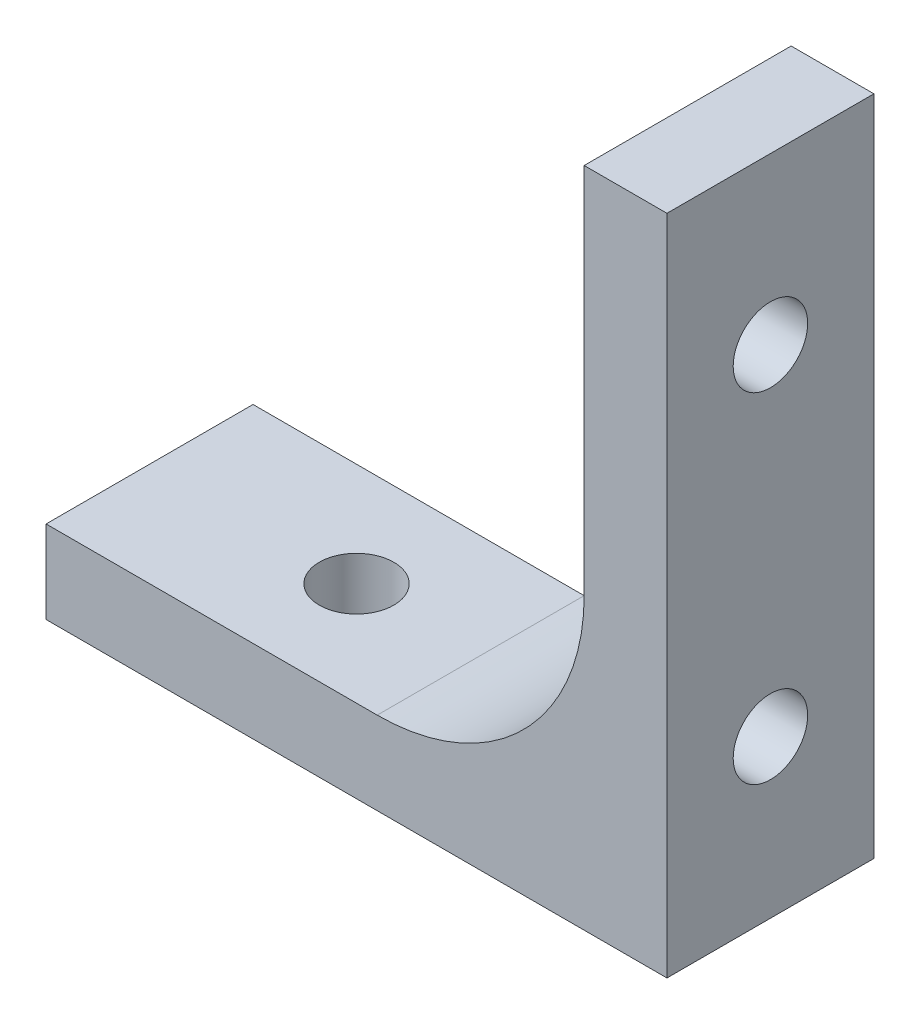
ISO-10303-21;
HEADER;
FILE_DESCRIPTION(('STEP AP214'),'2;1');
FILE_NAME('part.step','',(''),(''),'','','');
FILE_SCHEMA(('AUTOMOTIVE_DESIGN { 1 0 10303 214 1 1 1 1 }'));
ENDSEC;
DATA;
#1=APPLICATION_CONTEXT('core data for automotive mechanical design processes');
#2=APPLICATION_PROTOCOL_DEFINITION('international standard','automotive_design',2000,#1);
#3=PRODUCT_CONTEXT('',#1,'mechanical');
#4=PRODUCT('Part','Part','',(#3));
#5=PRODUCT_RELATED_PRODUCT_CATEGORY('part','',(#4));
#6=PRODUCT_DEFINITION_FORMATION('','',#4);
#7=PRODUCT_DEFINITION_CONTEXT('part definition',#1,'design');
#8=PRODUCT_DEFINITION('design','',#6,#7);
#9=PRODUCT_DEFINITION_SHAPE('','',#8);
#10=(LENGTH_UNIT() NAMED_UNIT(*) SI_UNIT(.MILLI.,.METRE.));
#11=(NAMED_UNIT(*) PLANE_ANGLE_UNIT() SI_UNIT($,.RADIAN.));
#12=(NAMED_UNIT(*) SI_UNIT($,.STERADIAN.) SOLID_ANGLE_UNIT());
#13=UNCERTAINTY_MEASURE_WITH_UNIT(LENGTH_MEASURE(1.E-05),#10,'distance_accuracy_value','');
#14=(GEOMETRIC_REPRESENTATION_CONTEXT(3) GLOBAL_UNCERTAINTY_ASSIGNED_CONTEXT((#13)) GLOBAL_UNIT_ASSIGNED_CONTEXT((#10,
#11,#12)) REPRESENTATION_CONTEXT('',''));
#15=CARTESIAN_POINT('',(0.,0.,0.));
#16=DIRECTION('',(0.,0.,1.));
#17=DIRECTION('',(1.,0.,0.));
#18=AXIS2_PLACEMENT_3D('',#15,#16,#17);
#19=CARTESIAN_POINT('',(0.,2.54,0.));
#20=DIRECTION('',(0.,-1.,0.));
#21=DIRECTION('',(0.,0.,-1.));
#22=AXIS2_PLACEMENT_3D('',#19,#20,#21);
#23=PLANE('',#22);
#24=CARTESIAN_POINT('',(6.35,2.54,-3.175));
#25=DIRECTION('',(0.,1.,0.));
#26=DIRECTION('',(0.,0.,1.));
#27=AXIS2_PLACEMENT_3D('',#24,#25,#26);
#28=CIRCLE('',#27,1.143);
#29=CARTESIAN_POINT('',(6.35,2.54,-2.032));
#30=VERTEX_POINT('',#29);
#31=EDGE_CURVE('E125',#30,#30,#28,.T.);
#32=ORIENTED_EDGE('',*,*,#31,.F.);
#33=EDGE_LOOP('',(#32));
#34=FACE_BOUND('',#33,.T.);
#35=DIRECTION('',(1.,0.,0.));
#36=VECTOR('',#35,1.);
#37=CARTESIAN_POINT('',(0.,2.54,0.));
#38=LINE('',#37,#36);
#39=CARTESIAN_POINT('',(0.,2.54,0.));
#40=VERTEX_POINT('',#39);
#41=CARTESIAN_POINT('',(10.16,2.54,0.));
#42=VERTEX_POINT('',#41);
#43=EDGE_CURVE('E135',#40,#42,#38,.T.);
#44=ORIENTED_EDGE('',*,*,#43,.T.);
#45=DIRECTION('',(0.,0.,1.));
#46=VECTOR('',#45,1.);
#47=CARTESIAN_POINT('',(10.16,2.54,-6.35));
#48=LINE('',#47,#46);
#49=CARTESIAN_POINT('',(10.16,2.54,-6.35));
#50=VERTEX_POINT('',#49);
#51=EDGE_CURVE('E60',#42,#50,#48,.F.);
#52=ORIENTED_EDGE('',*,*,#51,.T.);
#53=DIRECTION('',(-1.,0.,0.));
#54=VECTOR('',#53,1.);
#55=CARTESIAN_POINT('',(0.,2.54,-6.35));
#56=LINE('',#55,#54);
#57=CARTESIAN_POINT('',(0.,2.54,-6.35));
#58=VERTEX_POINT('',#57);
#59=EDGE_CURVE('E144',#50,#58,#56,.T.);
#60=ORIENTED_EDGE('',*,*,#59,.T.);
#61=DIRECTION('',(0.,0.,1.));
#62=VECTOR('',#61,1.);
#63=CARTESIAN_POINT('',(0.,2.54,0.));
#64=LINE('',#63,#62);
#65=EDGE_CURVE('E132',#58,#40,#64,.T.);
#66=ORIENTED_EDGE('',*,*,#65,.T.);
#67=EDGE_LOOP('',(#44,#52,#60,#66));
#68=FACE_BOUND('',#67,.T.);
#69=ADVANCED_FACE('F33',(#34,#68),#23,.F.);
#70=CARTESIAN_POINT('',(0.,2.54,0.));
#71=DIRECTION('',(1.,0.,0.));
#72=DIRECTION('',(0.,0.,-1.));
#73=AXIS2_PLACEMENT_3D('',#70,#71,#72);
#74=PLANE('',#73);
#75=DIRECTION('',(0.,0.,1.));
#76=VECTOR('',#75,1.);
#77=CARTESIAN_POINT('',(0.,0.,0.));
#78=LINE('',#77,#76);
#79=CARTESIAN_POINT('',(0.,0.,-6.35));
#80=VERTEX_POINT('',#79);
#81=CARTESIAN_POINT('',(0.,0.,0.));
#82=VERTEX_POINT('',#81);
#83=EDGE_CURVE('E151',#80,#82,#78,.T.);
#84=ORIENTED_EDGE('',*,*,#83,.T.);
#85=DIRECTION('',(0.,-1.,0.));
#86=VECTOR('',#85,1.);
#87=CARTESIAN_POINT('',(0.,2.54,0.));
#88=LINE('',#87,#86);
#89=EDGE_CURVE('E145',#40,#82,#88,.T.);
#90=ORIENTED_EDGE('',*,*,#89,.F.);
#91=ORIENTED_EDGE('',*,*,#65,.F.);
#92=DIRECTION('',(0.,-1.,0.));
#93=VECTOR('',#92,1.);
#94=CARTESIAN_POINT('',(0.,2.54,-6.35));
#95=LINE('',#94,#93);
#96=EDGE_CURVE('E107',#58,#80,#95,.T.);
#97=ORIENTED_EDGE('',*,*,#96,.T.);
#98=EDGE_LOOP('',(#84,#90,#91,#97));
#99=FACE_BOUND('',#98,.T.);
#100=ADVANCED_FACE('F203',(#99),#74,.F.);
#101=CARTESIAN_POINT('',(0.,2.54,0.));
#102=DIRECTION('',(0.,0.,-1.));
#103=DIRECTION('',(-1.,0.,0.));
#104=AXIS2_PLACEMENT_3D('',#101,#102,#103);
#105=PLANE('',#104);
#106=DIRECTION('',(1.,0.,0.));
#107=VECTOR('',#106,1.);
#108=CARTESIAN_POINT('',(0.,0.,0.));
#109=LINE('',#108,#107);
#110=CARTESIAN_POINT('',(19.05,0.,0.));
#111=VERTEX_POINT('',#110);
#112=EDGE_CURVE('E193',#82,#111,#109,.T.);
#113=ORIENTED_EDGE('',*,*,#112,.T.);
#114=DIRECTION('',(0.,-1.,0.));
#115=VECTOR('',#114,1.);
#116=CARTESIAN_POINT('',(19.05,2.54,0.));
#117=LINE('',#116,#115);
#118=CARTESIAN_POINT('',(19.05,20.32,0.));
#119=VERTEX_POINT('',#118);
#120=EDGE_CURVE('E106',#119,#111,#117,.T.);
#121=ORIENTED_EDGE('',*,*,#120,.F.);
#122=DIRECTION('',(1.,0.,0.));
#123=VECTOR('',#122,1.);
#124=CARTESIAN_POINT('',(19.05,20.32,0.));
#125=LINE('',#124,#123);
#126=CARTESIAN_POINT('',(16.51,20.32,0.));
#127=VERTEX_POINT('',#126);
#128=EDGE_CURVE('E121',#127,#119,#125,.T.);
#129=ORIENTED_EDGE('',*,*,#128,.F.);
#130=DIRECTION('',(0.,-1.,0.));
#131=VECTOR('',#130,1.);
#132=CARTESIAN_POINT('',(16.51,20.32,0.));
#133=LINE('',#132,#131);
#134=CARTESIAN_POINT('',(16.51,8.89,0.));
#135=VERTEX_POINT('',#134);
#136=EDGE_CURVE('E131',#127,#135,#133,.T.);
#137=ORIENTED_EDGE('',*,*,#136,.T.);
#138=CARTESIAN_POINT('',(10.16,8.89,0.));
#139=DIRECTION('',(0.,0.,-1.));
#140=DIRECTION('',(-1.,0.,0.));
#141=AXIS2_PLACEMENT_3D('',#138,#139,#140);
#142=CIRCLE('',#141,6.35);
#143=EDGE_CURVE('E46',#135,#42,#142,.T.);
#144=ORIENTED_EDGE('',*,*,#143,.T.);
#145=ORIENTED_EDGE('',*,*,#43,.F.);
#146=ORIENTED_EDGE('',*,*,#89,.T.);
#147=EDGE_LOOP('',(#113,#121,#129,#137,#144,#145,#146));
#148=FACE_BOUND('',#147,.T.);
#149=ADVANCED_FACE('F191',(#148),#105,.F.);
#150=CARTESIAN_POINT('',(19.05,2.54,0.));
#151=DIRECTION('',(-1.,0.,0.));
#152=DIRECTION('',(0.,0.,1.));
#153=AXIS2_PLACEMENT_3D('',#150,#151,#152);
#154=PLANE('',#153);
#155=CARTESIAN_POINT('',(19.05,4.826,-3.175));
#156=DIRECTION('',(-1.,0.,0.));
#157=DIRECTION('',(0.,0.,1.));
#158=AXIS2_PLACEMENT_3D('',#155,#156,#157);
#159=CIRCLE('',#158,1.143);
#160=CARTESIAN_POINT('',(19.05,4.826,-2.032));
#161=VERTEX_POINT('',#160);
#162=EDGE_CURVE('E170',#161,#161,#159,.T.);
#163=ORIENTED_EDGE('',*,*,#162,.T.);
#164=EDGE_LOOP('',(#163));
#165=FACE_BOUND('',#164,.T.);
#166=CARTESIAN_POINT('',(19.05,15.24,-3.175));
#167=DIRECTION('',(-1.,0.,0.));
#168=DIRECTION('',(0.,0.,1.));
#169=AXIS2_PLACEMENT_3D('',#166,#167,#168);
#170=CIRCLE('',#169,1.143);
#171=CARTESIAN_POINT('',(19.05,15.24,-2.032));
#172=VERTEX_POINT('',#171);
#173=EDGE_CURVE('E161',#172,#172,#170,.T.);
#174=ORIENTED_EDGE('',*,*,#173,.T.);
#175=EDGE_LOOP('',(#174));
#176=FACE_BOUND('',#175,.T.);
#177=DIRECTION('',(0.,0.,-1.));
#178=VECTOR('',#177,1.);
#179=CARTESIAN_POINT('',(19.05,0.,0.));
#180=LINE('',#179,#178);
#181=CARTESIAN_POINT('',(19.05,0.,-6.35));
#182=VERTEX_POINT('',#181);
#183=EDGE_CURVE('E103',#111,#182,#180,.T.);
#184=ORIENTED_EDGE('',*,*,#183,.T.);
#185=DIRECTION('',(0.,-1.,0.));
#186=VECTOR('',#185,1.);
#187=CARTESIAN_POINT('',(19.05,2.54,-6.35));
#188=LINE('',#187,#186);
#189=CARTESIAN_POINT('',(19.05,20.32,-6.35));
#190=VERTEX_POINT('',#189);
#191=EDGE_CURVE('E96',#190,#182,#188,.T.);
#192=ORIENTED_EDGE('',*,*,#191,.F.);
#193=DIRECTION('',(0.,0.,-1.));
#194=VECTOR('',#193,1.);
#195=CARTESIAN_POINT('',(19.05,20.32,-6.35));
#196=LINE('',#195,#194);
#197=EDGE_CURVE('E101',#119,#190,#196,.T.);
#198=ORIENTED_EDGE('',*,*,#197,.F.);
#199=ORIENTED_EDGE('',*,*,#120,.T.);
#200=EDGE_LOOP('',(#184,#192,#198,#199));
#201=FACE_BOUND('',#200,.T.);
#202=ADVANCED_FACE('F98',(#165,#176,#201),#154,.F.);
#203=CARTESIAN_POINT('',(0.,2.54,-6.35));
#204=DIRECTION('',(0.,0.,1.));
#205=DIRECTION('',(1.,0.,0.));
#206=AXIS2_PLACEMENT_3D('',#203,#204,#205);
#207=PLANE('',#206);
#208=DIRECTION('',(-1.,0.,0.));
#209=VECTOR('',#208,1.);
#210=CARTESIAN_POINT('',(0.,0.,-6.35));
#211=LINE('',#210,#209);
#212=EDGE_CURVE('E136',#182,#80,#211,.T.);
#213=ORIENTED_EDGE('',*,*,#212,.T.);
#214=ORIENTED_EDGE('',*,*,#96,.F.);
#215=ORIENTED_EDGE('',*,*,#59,.F.);
#216=CARTESIAN_POINT('',(10.16,8.89,-6.35));
#217=DIRECTION('',(0.,0.,1.));
#218=DIRECTION('',(1.,0.,0.));
#219=AXIS2_PLACEMENT_3D('',#216,#217,#218);
#220=CIRCLE('',#219,6.35);
#221=CARTESIAN_POINT('',(16.51,8.89,-6.35));
#222=VERTEX_POINT('',#221);
#223=EDGE_CURVE('E11',#50,#222,#220,.T.);
#224=ORIENTED_EDGE('',*,*,#223,.T.);
#225=DIRECTION('',(0.,-1.,0.));
#226=VECTOR('',#225,1.);
#227=CARTESIAN_POINT('',(16.51,20.32,-6.35));
#228=LINE('',#227,#226);
#229=CARTESIAN_POINT('',(16.51,20.32,-6.35));
#230=VERTEX_POINT('',#229);
#231=EDGE_CURVE('E113',#230,#222,#228,.T.);
#232=ORIENTED_EDGE('',*,*,#231,.F.);
#233=DIRECTION('',(-1.,0.,0.));
#234=VECTOR('',#233,1.);
#235=CARTESIAN_POINT('',(19.05,20.32,-6.35));
#236=LINE('',#235,#234);
#237=EDGE_CURVE('E110',#190,#230,#236,.T.);
#238=ORIENTED_EDGE('',*,*,#237,.F.);
#239=ORIENTED_EDGE('',*,*,#191,.T.);
#240=EDGE_LOOP('',(#213,#214,#215,#224,#232,#238,#239));
#241=FACE_BOUND('',#240,.T.);
#242=ADVANCED_FACE('F111',(#241),#207,.F.);
#243=CARTESIAN_POINT('',(0.,0.,0.));
#244=DIRECTION('',(0.,-1.,0.));
#245=DIRECTION('',(0.,0.,-1.));
#246=AXIS2_PLACEMENT_3D('',#243,#244,#245);
#247=PLANE('',#246);
#248=CARTESIAN_POINT('',(6.35,0.,-3.175));
#249=DIRECTION('',(0.,1.,0.));
#250=DIRECTION('',(0.,0.,1.));
#251=AXIS2_PLACEMENT_3D('',#248,#249,#250);
#252=CIRCLE('',#251,1.143);
#253=CARTESIAN_POINT('',(6.35,0.,-2.032));
#254=VERTEX_POINT('',#253);
#255=EDGE_CURVE('E122',#254,#254,#252,.T.);
#256=ORIENTED_EDGE('',*,*,#255,.T.);
#257=EDGE_LOOP('',(#256));
#258=FACE_BOUND('',#257,.T.);
#259=ORIENTED_EDGE('',*,*,#83,.F.);
#260=ORIENTED_EDGE('',*,*,#212,.F.);
#261=ORIENTED_EDGE('',*,*,#183,.F.);
#262=ORIENTED_EDGE('',*,*,#112,.F.);
#263=EDGE_LOOP('',(#259,#260,#261,#262));
#264=FACE_BOUND('',#263,.T.);
#265=ADVANCED_FACE('F206',(#258,#264),#247,.T.);
#266=CARTESIAN_POINT('',(16.51,20.32,-6.35));
#267=DIRECTION('',(1.,0.,0.));
#268=DIRECTION('',(0.,0.,-1.));
#269=AXIS2_PLACEMENT_3D('',#266,#267,#268);
#270=PLANE('',#269);
#271=CARTESIAN_POINT('',(16.51,15.24,-3.175));
#272=DIRECTION('',(1.,0.,0.));
#273=DIRECTION('',(0.,0.,-1.));
#274=AXIS2_PLACEMENT_3D('',#271,#272,#273);
#275=CIRCLE('',#274,1.143);
#276=CARTESIAN_POINT('',(16.51,15.24,-4.318));
#277=VERTEX_POINT('',#276);
#278=EDGE_CURVE('E159',#277,#277,#275,.T.);
#279=ORIENTED_EDGE('',*,*,#278,.T.);
#280=EDGE_LOOP('',(#279));
#281=FACE_BOUND('',#280,.T.);
#282=ORIENTED_EDGE('',*,*,#231,.T.);
#283=DIRECTION('',(0.,0.,1.));
#284=VECTOR('',#283,1.);
#285=CARTESIAN_POINT('',(16.51,8.89,0.));
#286=LINE('',#285,#284);
#287=EDGE_CURVE('E154',#222,#135,#286,.T.);
#288=ORIENTED_EDGE('',*,*,#287,.T.);
#289=ORIENTED_EDGE('',*,*,#136,.F.);
#290=DIRECTION('',(0.,0.,1.));
#291=VECTOR('',#290,1.);
#292=CARTESIAN_POINT('',(16.51,20.32,-6.35));
#293=LINE('',#292,#291);
#294=EDGE_CURVE('E116',#230,#127,#293,.T.);
#295=ORIENTED_EDGE('',*,*,#294,.F.);
#296=EDGE_LOOP('',(#282,#288,#289,#295));
#297=FACE_BOUND('',#296,.T.);
#298=ADVANCED_FACE('F189',(#281,#297),#270,.F.);
#299=CARTESIAN_POINT('',(0.,20.32,0.));
#300=DIRECTION('',(0.,-1.,0.));
#301=DIRECTION('',(0.,0.,-1.));
#302=AXIS2_PLACEMENT_3D('',#299,#300,#301);
#303=PLANE('',#302);
#304=ORIENTED_EDGE('',*,*,#197,.T.);
#305=ORIENTED_EDGE('',*,*,#237,.T.);
#306=ORIENTED_EDGE('',*,*,#294,.T.);
#307=ORIENTED_EDGE('',*,*,#128,.T.);
#308=EDGE_LOOP('',(#304,#305,#306,#307));
#309=FACE_BOUND('',#308,.T.);
#310=ADVANCED_FACE('F119',(#309),#303,.F.);
#311=CARTESIAN_POINT('',(10.16,8.89,-6.35));
#312=DIRECTION('',(0.,0.,-1.));
#313=DIRECTION('',(-1.,0.,0.));
#314=AXIS2_PLACEMENT_3D('',#311,#312,#313);
#315=CYLINDRICAL_SURFACE('',#314,6.35);
#316=CARTESIAN_POINT('',(15.0391806689238,4.826,-2.032));
#317=CARTESIAN_POINT('',(14.9774326267272,4.75187038033432,-2.03199948532092));
#318=CARTESIAN_POINT('',(14.9139559337185,4.67912229752183,-2.03920382856172));
#319=CARTESIAN_POINT('',(14.7849612855506,4.53782263678341,-2.06657622464244));
#320=CARTESIAN_POINT('',(14.7194385201622,4.46928228026593,-2.08677742187469));
#321=CARTESIAN_POINT('',(14.576867810189,4.32650110282094,-2.1435929029482));
#322=CARTESIAN_POINT('',(14.4997133791037,4.25320461641569,-2.1823761832689));
#323=CARTESIAN_POINT('',(14.3856319365159,4.14983195764603,-2.25251753998423));
#324=CARTESIAN_POINT('',(14.3478849418401,4.11647391924231,-2.27788805189778));
#325=CARTESIAN_POINT('',(14.2733920143054,4.05213695596521,-2.33275784226209));
#326=CARTESIAN_POINT('',(14.236645526125,4.02115669321405,-2.3622547721769));
#327=CARTESIAN_POINT('',(14.1578325810626,3.95614557653586,-2.43170703458203));
#328=CARTESIAN_POINT('',(14.1161042586206,3.92267604053756,-2.47258250879541));
#329=CARTESIAN_POINT('',(14.0365389737928,3.86033941267621,-2.56109960679906));
#330=CARTESIAN_POINT('',(13.9986965587793,3.83146583964392,-2.60873152010058));
#331=CARTESIAN_POINT('',(13.9384929192648,3.78642087622941,-2.69800151795059));
#332=CARTESIAN_POINT('',(13.9146691878263,3.76890123524195,-2.73795828411357));
#333=CARTESIAN_POINT('',(13.8721043056947,3.7379642090501,-2.82198237191112));
#334=CARTESIAN_POINT('',(13.8533543732803,3.72453973075101,-2.86604241157043));
#335=CARTESIAN_POINT('',(13.8260949264989,3.70516944068857,-2.94793394042806));
#336=CARTESIAN_POINT('',(13.8162528497321,3.69823814998585,-2.98508179093242));
#337=CARTESIAN_POINT('',(13.8017755332753,3.68807233442554,-3.06086717906191));
#338=CARTESIAN_POINT('',(13.7971347374102,3.68483386471361,-3.09950308136302));
#339=CARTESIAN_POINT('',(13.7935609317451,3.68233825358501,-3.17730156621988));
#340=CARTESIAN_POINT('',(13.794646390689,3.68309399460908,-3.21646544610399));
#341=CARTESIAN_POINT('',(13.8024374973018,3.68854157651504,-3.29395299591633));
#342=CARTESIAN_POINT('',(13.8091472639948,3.69323630215837,-3.33227602892693));
#343=CARTESIAN_POINT('',(13.8292306539192,3.70739241964673,-3.41417747653932));
#344=CARTESIAN_POINT('',(13.8436271451113,3.71758924290882,-3.4573733064842));
#345=CARTESIAN_POINT('',(13.8777880130529,3.74208839508035,-3.5403293209338));
#346=CARTESIAN_POINT('',(13.8975624077687,3.75639838886831,-3.58008290917457));
#347=CARTESIAN_POINT('',(13.9517200439637,3.79618400650943,-3.67471462165583));
#348=CARTESIAN_POINT('',(13.9884932925292,3.82368263493769,-3.72735757683579));
#349=CARTESIAN_POINT('',(14.0671915254054,3.88411896914318,-3.82509351688213));
#350=CARTESIAN_POINT('',(14.1091291336368,3.91707007344309,-3.87016733804134));
#351=CARTESIAN_POINT('',(14.2192756606594,4.00613969272027,-3.9758073513279));
#352=CARTESIAN_POINT('',(14.2895289787704,4.0652166881744,-4.03174811133273));
#353=CARTESIAN_POINT('',(14.4326823522889,4.1915042077493,-4.12905066260182));
#354=CARTESIAN_POINT('',(14.5055854558961,4.258724320883,-4.1703950371376));
#355=CARTESIAN_POINT('',(14.6536560341401,4.40218480274578,-4.23959038788531));
#356=CARTESIAN_POINT('',(14.7288266339966,4.47863333778967,-4.26700553809044));
#357=CARTESIAN_POINT('',(14.8770199817691,4.63747304024122,-4.30529373504618));
#358=CARTESIAN_POINT('',(14.9500450334927,4.71985747914129,-4.31618521218928));
#359=CARTESIAN_POINT('',(15.0796790613235,4.87408069918172,-4.31912344358079));
#360=CARTESIAN_POINT('',(15.1369534063114,4.94530052684313,-4.31408549204538));
#361=CARTESIAN_POINT('',(15.2472528904775,5.08861970925108,-4.28978517276867));
#362=CARTESIAN_POINT('',(15.3002832188777,5.16071786174897,-4.27054047972395));
#363=CARTESIAN_POINT('',(15.3915323174834,5.29018385225941,-4.22136093783395));
#364=CARTESIAN_POINT('',(15.4306948463456,5.34785637064984,-4.19399070428258));
#365=CARTESIAN_POINT('',(15.504316854786,5.45994694614213,-4.12829596274705));
#366=CARTESIAN_POINT('',(15.538777505743,5.51436581192151,-4.08997419050871));
#367=CARTESIAN_POINT('',(15.6023579078738,5.61785044694516,-4.00208093286628));
#368=CARTESIAN_POINT('',(15.6314349764557,5.66687228265933,-3.95242597887313));
#369=CARTESIAN_POINT('',(15.6830968731535,5.75622049838018,-3.84292047821758));
#370=CARTESIAN_POINT('',(15.7056867978692,5.79655369832132,-3.78307799455436));
#371=CARTESIAN_POINT('',(15.7411847553669,5.86113012073474,-3.66379179134765));
#372=CARTESIAN_POINT('',(15.7549896770489,5.88681264400009,-3.60539164865755));
#373=CARTESIAN_POINT('',(15.7770338995624,5.92824583662125,-3.4841852708728));
#374=CARTESIAN_POINT('',(15.7852767503416,5.94400284043336,-3.42138187443298));
#375=CARTESIAN_POINT('',(15.7955513242682,5.96371032946167,-3.29954906157309));
#376=CARTESIAN_POINT('',(15.7980922915029,5.96862804394679,-3.24071678599364));
#377=CARTESIAN_POINT('',(15.7984566418872,5.96933086031654,-3.12299050086159));
#378=CARTESIAN_POINT('',(15.7962813253286,5.96511847939242,-3.06409651279786));
#379=CARTESIAN_POINT('',(15.7873770060353,5.94802535428283,-2.94970808110297));
#380=CARTESIAN_POINT('',(15.7807821589102,5.93540004806198,-2.89416458166042));
#381=CARTESIAN_POINT('',(15.7632679531208,5.90231932147332,-2.78618861766411));
#382=CARTESIAN_POINT('',(15.7523485440738,5.88186380988061,-2.73375618936372));
#383=CARTESIAN_POINT('',(15.7260784334945,5.83352511212373,-2.63226034167481));
#384=CARTESIAN_POINT('',(15.7106416308096,5.80549850558558,-2.58328781196479));
#385=CARTESIAN_POINT('',(15.6756823967498,5.74341230216545,-2.49096715529487));
#386=CARTESIAN_POINT('',(15.6561591973972,5.7093515714446,-2.44762008804128));
#387=CARTESIAN_POINT('',(15.6118740223879,5.63398963994452,-2.36446742007465));
#388=CARTESIAN_POINT('',(15.5868437649195,5.59235125337521,-2.32511164455339));
#389=CARTESIAN_POINT('',(15.5329515746011,5.50525242290872,-2.25400552030988));
#390=CARTESIAN_POINT('',(15.5040877485435,5.45979009465244,-2.22225895126127));
#391=CARTESIAN_POINT('',(15.4392684267259,5.36073079383279,-2.16295099106171));
#392=CARTESIAN_POINT('',(15.4028773464416,5.3068224590466,-2.13639014542258));
#393=CARTESIAN_POINT('',(15.3266399929977,5.19774293120316,-2.09254213802811));
#394=CARTESIAN_POINT('',(15.2867933761102,5.14257161291759,-2.07525590006482));
#395=CARTESIAN_POINT('',(15.2127066622016,5.04348539746099,-2.05197324637713));
#396=CARTESIAN_POINT('',(15.1789659968189,4.99955427737345,-2.0443991632641));
#397=CARTESIAN_POINT('',(15.1100697823375,4.91226133034309,-2.03441351505443));
#398=CARTESIAN_POINT('',(15.0749146897015,4.86889932563275,-2.03200029784836));
#399=CARTESIAN_POINT('',(15.0391806689238,4.826,-2.032));
#400=B_SPLINE_CURVE_WITH_KNOTS('',3,(#316,#317,#318,#319,#320,#321,#322,#323,#324,#325,#326,
#327,#328,#329,#330,#331,#332,#333,#334,#335,#336,#337,#338,#339,#340,#341,#342,#343,#344,#345,
#346,#347,#348,#349,#350,#351,#352,#353,#354,#355,#356,#357,#358,#359,#360,#361,#362,#363,#364,
#365,#366,#367,#368,#369,#370,#371,#372,#373,#374,#375,#376,#377,#378,#379,#380,#381,#382,#383,
#384,#385,#386,#387,#388,#389,#390,#391,#392,#393,#394,#395,#396,#397,#398,#399),.UNSPECIFIED.,
.T.,.F.,(4,2,2,2,2,2,2,2,2,2,2,2,2,2,2,2,2,2,2,2,2,2,2,2,2,2,2,2,2,2,2,2,2,2,2,2,2,2,2,2,2,4),
(0.,0.289271113395382,0.57928286176738,0.917469084799527,1.08651533028657,1.25546575221001,
1.45694948898622,1.6581465293948,1.80682075725259,1.95523598983795,2.07190476446623,
2.18844879062796,2.30536893262071,2.42237477726454,2.56158210445731,2.70105054476961,
2.90944746899245,3.11836431226617,3.43913200947175,3.76028117032978,4.09094031761274,
4.4212303780755,4.69479332769323,4.9680165082787,5.19179833721749,5.41552431319586,
5.64095447082305,5.86620703251017,6.06095373328584,6.25557602065845,6.43197758316221,
6.60833051747922,6.77955906998555,6.95078961743066,7.12552388136204,7.30029101353386,
7.48710034530124,7.67400227828626,7.8839783536426,8.09397533966672,8.26143215632296,
8.42883535825039),.UNSPECIFIED.);
#401=CARTESIAN_POINT('',(15.0391806689238,4.826,-2.032));
#402=VERTEX_POINT('',#401);
#403=EDGE_CURVE('E38',#402,#402,#400,.T.);
#404=ORIENTED_EDGE('',*,*,#403,.T.);
#405=EDGE_LOOP('',(#404));
#406=FACE_BOUND('',#405,.T.);
#407=ORIENTED_EDGE('',*,*,#223,.F.);
#408=ORIENTED_EDGE('',*,*,#51,.F.);
#409=ORIENTED_EDGE('',*,*,#143,.F.);
#410=ORIENTED_EDGE('',*,*,#287,.F.);
#411=EDGE_LOOP('',(#407,#408,#409,#410));
#412=FACE_BOUND('',#411,.T.);
#413=ADVANCED_FACE('F35',(#406,#412),#315,.F.);
#414=CARTESIAN_POINT('',(6.35,0.,-3.175));
#415=DIRECTION('',(0.,1.,0.));
#416=DIRECTION('',(0.,0.,1.));
#417=AXIS2_PLACEMENT_3D('',#414,#415,#416);
#418=CYLINDRICAL_SURFACE('',#417,1.143);
#419=ORIENTED_EDGE('',*,*,#255,.F.);
#420=EDGE_LOOP('',(#419));
#421=FACE_BOUND('',#420,.T.);
#422=ORIENTED_EDGE('',*,*,#31,.T.);
#423=EDGE_LOOP('',(#422));
#424=FACE_BOUND('',#423,.T.);
#425=ADVANCED_FACE('F184',(#421,#424),#418,.F.);
#426=CARTESIAN_POINT('',(19.05,15.24,-3.175));
#427=DIRECTION('',(-1.,0.,0.));
#428=DIRECTION('',(0.,0.,1.));
#429=AXIS2_PLACEMENT_3D('',#426,#427,#428);
#430=CYLINDRICAL_SURFACE('',#429,1.143);
#431=ORIENTED_EDGE('',*,*,#173,.F.);
#432=EDGE_LOOP('',(#431));
#433=FACE_BOUND('',#432,.T.);
#434=ORIENTED_EDGE('',*,*,#278,.F.);
#435=EDGE_LOOP('',(#434));
#436=FACE_BOUND('',#435,.T.);
#437=ADVANCED_FACE('F179',(#433,#436),#430,.F.);
#438=CARTESIAN_POINT('',(19.05,4.826,-3.175));
#439=DIRECTION('',(-1.,0.,0.));
#440=DIRECTION('',(0.,0.,1.));
#441=AXIS2_PLACEMENT_3D('',#438,#439,#440);
#442=CYLINDRICAL_SURFACE('',#441,1.143);
#443=ORIENTED_EDGE('',*,*,#162,.F.);
#444=EDGE_LOOP('',(#443));
#445=FACE_BOUND('',#444,.T.);
#446=ORIENTED_EDGE('',*,*,#403,.F.);
#447=EDGE_LOOP('',(#446));
#448=FACE_BOUND('',#447,.T.);
#449=ADVANCED_FACE('F176',(#445,#448),#442,.F.);
#450=CLOSED_SHELL('',(#69,#100,#149,#202,#242,#265,#298,#310,#413,#425,#437,#449));
#451=MANIFOLD_SOLID_BREP('B2',#450);
#452=ADVANCED_BREP_SHAPE_REPRESENTATION('',(#18,#451),#14);
#453=SHAPE_DEFINITION_REPRESENTATION(#9,#452);
ENDSEC;
END-ISO-10303-21;
